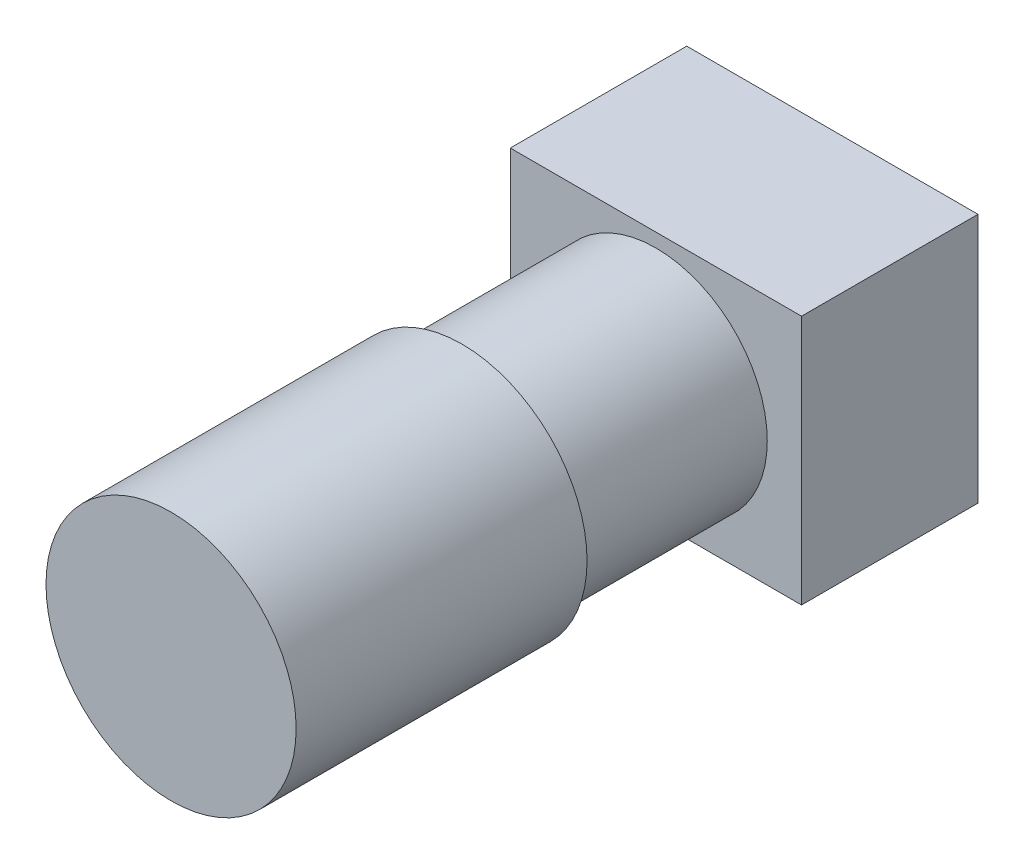
ISO-10303-21;
HEADER;
FILE_DESCRIPTION(('STEP AP214'),'2;1');
FILE_NAME('part.step','',(''),(''),'','','');
FILE_SCHEMA(('AUTOMOTIVE_DESIGN { 1 0 10303 214 1 1 1 1 }'));
ENDSEC;
DATA;
#1=APPLICATION_CONTEXT('core data for automotive mechanical design processes');
#2=APPLICATION_PROTOCOL_DEFINITION('international standard','automotive_design',2000,#1);
#3=PRODUCT_CONTEXT('',#1,'mechanical');
#4=PRODUCT('Part','Part','',(#3));
#5=PRODUCT_RELATED_PRODUCT_CATEGORY('part','',(#4));
#6=PRODUCT_DEFINITION_FORMATION('','',#4);
#7=PRODUCT_DEFINITION_CONTEXT('part definition',#1,'design');
#8=PRODUCT_DEFINITION('design','',#6,#7);
#9=PRODUCT_DEFINITION_SHAPE('','',#8);
#10=(LENGTH_UNIT() NAMED_UNIT(*) SI_UNIT(.MILLI.,.METRE.));
#11=(NAMED_UNIT(*) PLANE_ANGLE_UNIT() SI_UNIT($,.RADIAN.));
#12=(NAMED_UNIT(*) SI_UNIT($,.STERADIAN.) SOLID_ANGLE_UNIT());
#13=UNCERTAINTY_MEASURE_WITH_UNIT(LENGTH_MEASURE(1.E-05),#10,'distance_accuracy_value','');
#14=(GEOMETRIC_REPRESENTATION_CONTEXT(3) GLOBAL_UNCERTAINTY_ASSIGNED_CONTEXT((#13)) GLOBAL_UNIT_ASSIGNED_CONTEXT((#10,
#11,#12)) REPRESENTATION_CONTEXT('',''));
#15=CARTESIAN_POINT('',(0.,0.,0.));
#16=DIRECTION('',(0.,0.,1.));
#17=DIRECTION('',(1.,0.,0.));
#18=AXIS2_PLACEMENT_3D('',#15,#16,#17);
#19=CARTESIAN_POINT('',(85.,-73.,103.));
#20=DIRECTION('',(-1.,0.,0.));
#21=DIRECTION('',(0.,0.,1.));
#22=AXIS2_PLACEMENT_3D('',#19,#20,#21);
#23=PLANE('',#22);
#24=DIRECTION('',(0.,1.,0.));
#25=VECTOR('',#24,1.);
#26=CARTESIAN_POINT('',(85.,-73.,0.));
#27=LINE('',#26,#25);
#28=CARTESIAN_POINT('',(85.,-73.,0.));
#29=VERTEX_POINT('',#28);
#30=CARTESIAN_POINT('',(85.,73.,0.));
#31=VERTEX_POINT('',#30);
#32=EDGE_CURVE('E104',#29,#31,#27,.T.);
#33=ORIENTED_EDGE('',*,*,#32,.T.);
#34=DIRECTION('',(0.,0.,-1.));
#35=VECTOR('',#34,1.);
#36=CARTESIAN_POINT('',(85.,73.,103.));
#37=LINE('',#36,#35);
#38=CARTESIAN_POINT('',(85.,73.,103.));
#39=VERTEX_POINT('',#38);
#40=EDGE_CURVE('E41',#39,#31,#37,.T.);
#41=ORIENTED_EDGE('',*,*,#40,.F.);
#42=DIRECTION('',(0.,1.,0.));
#43=VECTOR('',#42,1.);
#44=CARTESIAN_POINT('',(85.,-73.,103.));
#45=LINE('',#44,#43);
#46=CARTESIAN_POINT('',(85.,-73.,103.));
#47=VERTEX_POINT('',#46);
#48=EDGE_CURVE('E91',#47,#39,#45,.T.);
#49=ORIENTED_EDGE('',*,*,#48,.F.);
#50=DIRECTION('',(0.,0.,-1.));
#51=VECTOR('',#50,1.);
#52=CARTESIAN_POINT('',(85.,-73.,103.));
#53=LINE('',#52,#51);
#54=EDGE_CURVE('E100',#47,#29,#53,.T.);
#55=ORIENTED_EDGE('',*,*,#54,.T.);
#56=EDGE_LOOP('',(#33,#41,#49,#55));
#57=FACE_BOUND('',#56,.T.);
#58=ADVANCED_FACE('F38',(#57),#23,.F.);
#59=CARTESIAN_POINT('',(-85.,73.,103.));
#60=DIRECTION('',(0.,-1.,0.));
#61=DIRECTION('',(0.,0.,-1.));
#62=AXIS2_PLACEMENT_3D('',#59,#60,#61);
#63=PLANE('',#62);
#64=DIRECTION('',(-1.,0.,0.));
#65=VECTOR('',#64,1.);
#66=CARTESIAN_POINT('',(-85.,73.,0.));
#67=LINE('',#66,#65);
#68=CARTESIAN_POINT('',(-85.,73.,0.));
#69=VERTEX_POINT('',#68);
#70=EDGE_CURVE('E96',#31,#69,#67,.T.);
#71=ORIENTED_EDGE('',*,*,#70,.T.);
#72=DIRECTION('',(0.,0.,-1.));
#73=VECTOR('',#72,1.);
#74=CARTESIAN_POINT('',(-85.,73.,103.));
#75=LINE('',#74,#73);
#76=CARTESIAN_POINT('',(-85.,73.,103.));
#77=VERTEX_POINT('',#76);
#78=EDGE_CURVE('E94',#77,#69,#75,.T.);
#79=ORIENTED_EDGE('',*,*,#78,.F.);
#80=DIRECTION('',(-1.,0.,0.));
#81=VECTOR('',#80,1.);
#82=CARTESIAN_POINT('',(-85.,73.,103.));
#83=LINE('',#82,#81);
#84=EDGE_CURVE('E86',#39,#77,#83,.T.);
#85=ORIENTED_EDGE('',*,*,#84,.F.);
#86=ORIENTED_EDGE('',*,*,#40,.T.);
#87=EDGE_LOOP('',(#71,#79,#85,#86));
#88=FACE_BOUND('',#87,.T.);
#89=ADVANCED_FACE('F95',(#88),#63,.F.);
#90=CARTESIAN_POINT('',(-85.,-73.,103.));
#91=DIRECTION('',(1.,0.,0.));
#92=DIRECTION('',(0.,0.,-1.));
#93=AXIS2_PLACEMENT_3D('',#90,#91,#92);
#94=PLANE('',#93);
#95=DIRECTION('',(0.,-1.,0.));
#96=VECTOR('',#95,1.);
#97=CARTESIAN_POINT('',(-85.,-73.,0.));
#98=LINE('',#97,#96);
#99=CARTESIAN_POINT('',(-85.,-73.,0.));
#100=VERTEX_POINT('',#99);
#101=EDGE_CURVE('E72',#69,#100,#98,.T.);
#102=ORIENTED_EDGE('',*,*,#101,.T.);
#103=DIRECTION('',(0.,0.,-1.));
#104=VECTOR('',#103,1.);
#105=CARTESIAN_POINT('',(-85.,-73.,103.));
#106=LINE('',#105,#104);
#107=CARTESIAN_POINT('',(-85.,-73.,103.));
#108=VERTEX_POINT('',#107);
#109=EDGE_CURVE('E97',#108,#100,#106,.T.);
#110=ORIENTED_EDGE('',*,*,#109,.F.);
#111=DIRECTION('',(0.,-1.,0.));
#112=VECTOR('',#111,1.);
#113=CARTESIAN_POINT('',(-85.,-73.,103.));
#114=LINE('',#113,#112);
#115=EDGE_CURVE('E89',#77,#108,#114,.T.);
#116=ORIENTED_EDGE('',*,*,#115,.F.);
#117=ORIENTED_EDGE('',*,*,#78,.T.);
#118=EDGE_LOOP('',(#102,#110,#116,#117));
#119=FACE_BOUND('',#118,.T.);
#120=ADVANCED_FACE('F98',(#119),#94,.F.);
#121=CARTESIAN_POINT('',(-85.,-73.,103.));
#122=DIRECTION('',(0.,1.,0.));
#123=DIRECTION('',(0.,0.,1.));
#124=AXIS2_PLACEMENT_3D('',#121,#122,#123);
#125=PLANE('',#124);
#126=DIRECTION('',(1.,0.,0.));
#127=VECTOR('',#126,1.);
#128=CARTESIAN_POINT('',(-85.,-73.,0.));
#129=LINE('',#128,#127);
#130=EDGE_CURVE('E78',#100,#29,#129,.T.);
#131=ORIENTED_EDGE('',*,*,#130,.T.);
#132=ORIENTED_EDGE('',*,*,#54,.F.);
#133=DIRECTION('',(1.,0.,0.));
#134=VECTOR('',#133,1.);
#135=CARTESIAN_POINT('',(-85.,-73.,103.));
#136=LINE('',#135,#134);
#137=EDGE_CURVE('E55',#108,#47,#136,.T.);
#138=ORIENTED_EDGE('',*,*,#137,.F.);
#139=ORIENTED_EDGE('',*,*,#109,.T.);
#140=EDGE_LOOP('',(#131,#132,#138,#139));
#141=FACE_BOUND('',#140,.T.);
#142=ADVANCED_FACE('F112',(#141),#125,.F.);
#143=CARTESIAN_POINT('',(0.,0.,103.));
#144=DIRECTION('',(0.,0.,-1.));
#145=DIRECTION('',(-1.,0.,0.));
#146=AXIS2_PLACEMENT_3D('',#143,#144,#145);
#147=PLANE('',#146);
#148=CARTESIAN_POINT('',(0.,0.,103.));
#149=DIRECTION('',(0.,0.,1.));
#150=DIRECTION('',(1.,0.,0.));
#151=AXIS2_PLACEMENT_3D('',#148,#149,#150);
#152=CIRCLE('',#151,65.);
#153=CARTESIAN_POINT('',(65.,0.,103.));
#154=VERTEX_POINT('',#153);
#155=EDGE_CURVE('E11',#154,#154,#152,.T.);
#156=ORIENTED_EDGE('',*,*,#155,.F.);
#157=EDGE_LOOP('',(#156));
#158=FACE_BOUND('',#157,.T.);
#159=ORIENTED_EDGE('',*,*,#48,.T.);
#160=ORIENTED_EDGE('',*,*,#84,.T.);
#161=ORIENTED_EDGE('',*,*,#115,.T.);
#162=ORIENTED_EDGE('',*,*,#137,.T.);
#163=EDGE_LOOP('',(#159,#160,#161,#162));
#164=FACE_BOUND('',#163,.T.);
#165=ADVANCED_FACE('F87',(#158,#164),#147,.F.);
#166=CARTESIAN_POINT('',(0.,0.,0.));
#167=DIRECTION('',(0.,0.,-1.));
#168=DIRECTION('',(-1.,0.,0.));
#169=AXIS2_PLACEMENT_3D('',#166,#167,#168);
#170=PLANE('',#169);
#171=ORIENTED_EDGE('',*,*,#32,.F.);
#172=ORIENTED_EDGE('',*,*,#130,.F.);
#173=ORIENTED_EDGE('',*,*,#101,.F.);
#174=ORIENTED_EDGE('',*,*,#70,.F.);
#175=EDGE_LOOP('',(#171,#172,#173,#174));
#176=FACE_BOUND('',#175,.T.);
#177=ADVANCED_FACE('F115',(#176),#170,.T.);
#178=CARTESIAN_POINT('',(0.,0.,216.2));
#179=DIRECTION('',(0.,0.,-1.));
#180=DIRECTION('',(-1.,0.,0.));
#181=AXIS2_PLACEMENT_3D('',#178,#179,#180);
#182=CYLINDRICAL_SURFACE('',#181,65.);
#183=CARTESIAN_POINT('',(0.,0.,216.2));
#184=DIRECTION('',(0.,0.,1.));
#185=DIRECTION('',(1.,0.,0.));
#186=AXIS2_PLACEMENT_3D('',#183,#184,#185);
#187=CIRCLE('',#186,65.);
#188=CARTESIAN_POINT('',(65.,0.,216.2));
#189=VERTEX_POINT('',#188);
#190=EDGE_CURVE('E107',#189,#189,#187,.T.);
#191=ORIENTED_EDGE('',*,*,#190,.F.);
#192=EDGE_LOOP('',(#191));
#193=FACE_BOUND('',#192,.T.);
#194=ORIENTED_EDGE('',*,*,#155,.T.);
#195=EDGE_LOOP('',(#194));
#196=FACE_BOUND('',#195,.T.);
#197=ADVANCED_FACE('F132',(#193,#196),#182,.T.);
#198=CARTESIAN_POINT('',(0.,0.,386.));
#199=DIRECTION('',(0.,0.,-1.));
#200=DIRECTION('',(-1.,0.,0.));
#201=AXIS2_PLACEMENT_3D('',#198,#199,#200);
#202=CYLINDRICAL_SURFACE('',#201,73.);
#203=CARTESIAN_POINT('',(0.,0.,386.));
#204=DIRECTION('',(0.,0.,1.));
#205=DIRECTION('',(1.,0.,0.));
#206=AXIS2_PLACEMENT_3D('',#203,#204,#205);
#207=CIRCLE('',#206,73.);
#208=CARTESIAN_POINT('',(73.,0.,386.));
#209=VERTEX_POINT('',#208);
#210=EDGE_CURVE('E120',#209,#209,#207,.T.);
#211=ORIENTED_EDGE('',*,*,#210,.F.);
#212=EDGE_LOOP('',(#211));
#213=FACE_BOUND('',#212,.T.);
#214=CARTESIAN_POINT('',(0.,0.,216.2));
#215=DIRECTION('',(0.,0.,1.));
#216=DIRECTION('',(1.,0.,0.));
#217=AXIS2_PLACEMENT_3D('',#214,#215,#216);
#218=CIRCLE('',#217,73.);
#219=CARTESIAN_POINT('',(73.,0.,216.2));
#220=VERTEX_POINT('',#219);
#221=EDGE_CURVE('E121',#220,#220,#218,.T.);
#222=ORIENTED_EDGE('',*,*,#221,.T.);
#223=EDGE_LOOP('',(#222));
#224=FACE_BOUND('',#223,.T.);
#225=ADVANCED_FACE('F129',(#213,#224),#202,.T.);
#226=CARTESIAN_POINT('',(0.,0.,386.));
#227=DIRECTION('',(0.,0.,1.));
#228=DIRECTION('',(1.,0.,0.));
#229=AXIS2_PLACEMENT_3D('',#226,#227,#228);
#230=PLANE('',#229);
#231=ORIENTED_EDGE('',*,*,#210,.T.);
#232=EDGE_LOOP('',(#231));
#233=FACE_BOUND('',#232,.T.);
#234=ADVANCED_FACE('F127',(#233),#230,.T.);
#235=CARTESIAN_POINT('',(0.,0.,216.2));
#236=DIRECTION('',(0.,0.,1.));
#237=DIRECTION('',(1.,0.,0.));
#238=AXIS2_PLACEMENT_3D('',#235,#236,#237);
#239=PLANE('',#238);
#240=ORIENTED_EDGE('',*,*,#190,.T.);
#241=EDGE_LOOP('',(#240));
#242=FACE_BOUND('',#241,.T.);
#243=ORIENTED_EDGE('',*,*,#221,.F.);
#244=EDGE_LOOP('',(#243));
#245=FACE_BOUND('',#244,.T.);
#246=ADVANCED_FACE('F136',(#242,#245),#239,.F.);
#247=CLOSED_SHELL('',(#58,#89,#120,#142,#165,#177,#197,#225,#234,#246));
#248=MANIFOLD_SOLID_BREP('B2',#247);
#249=ADVANCED_BREP_SHAPE_REPRESENTATION('',(#18,#248),#14);
#250=SHAPE_DEFINITION_REPRESENTATION(#9,#249);
ENDSEC;
END-ISO-10303-21;
